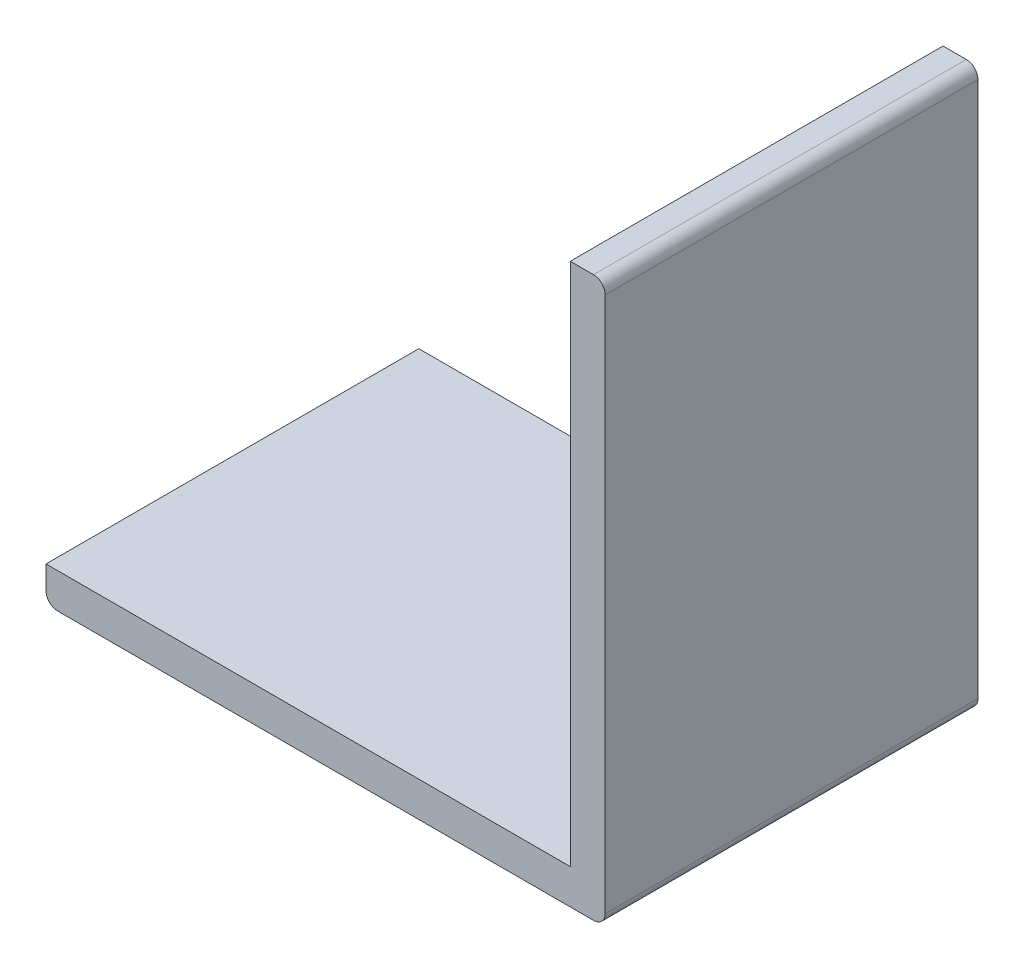
ISO-10303-21;
HEADER;
FILE_DESCRIPTION(('STEP AP214'),'2;1');
FILE_NAME('part.step','',(''),(''),'','','');
FILE_SCHEMA(('AUTOMOTIVE_DESIGN { 1 0 10303 214 1 1 1 1 }'));
ENDSEC;
DATA;
#1=APPLICATION_CONTEXT('core data for automotive mechanical design processes');
#2=APPLICATION_PROTOCOL_DEFINITION('international standard','automotive_design',2000,#1);
#3=PRODUCT_CONTEXT('',#1,'mechanical');
#4=PRODUCT('Part','Part','',(#3));
#5=PRODUCT_RELATED_PRODUCT_CATEGORY('part','',(#4));
#6=PRODUCT_DEFINITION_FORMATION('','',#4);
#7=PRODUCT_DEFINITION_CONTEXT('part definition',#1,'design');
#8=PRODUCT_DEFINITION('design','',#6,#7);
#9=PRODUCT_DEFINITION_SHAPE('','',#8);
#10=(LENGTH_UNIT() NAMED_UNIT(*) SI_UNIT(.MILLI.,.METRE.));
#11=(NAMED_UNIT(*) PLANE_ANGLE_UNIT() SI_UNIT($,.RADIAN.));
#12=(NAMED_UNIT(*) SI_UNIT($,.STERADIAN.) SOLID_ANGLE_UNIT());
#13=UNCERTAINTY_MEASURE_WITH_UNIT(LENGTH_MEASURE(1.E-05),#10,'distance_accuracy_value','');
#14=(GEOMETRIC_REPRESENTATION_CONTEXT(3) GLOBAL_UNCERTAINTY_ASSIGNED_CONTEXT((#13)) GLOBAL_UNIT_ASSIGNED_CONTEXT((#10,
#11,#12)) REPRESENTATION_CONTEXT('',''));
#15=CARTESIAN_POINT('',(0.,0.,0.));
#16=DIRECTION('',(0.,0.,1.));
#17=DIRECTION('',(1.,0.,0.));
#18=AXIS2_PLACEMENT_3D('',#15,#16,#17);
#19=CARTESIAN_POINT('',(-190.441035714286,0.,-101.6));
#20=DIRECTION('',(-1.,0.,0.));
#21=DIRECTION('',(0.,0.,1.));
#22=AXIS2_PLACEMENT_3D('',#19,#20,#21);
#23=PLANE('',#22);
#24=DIRECTION('',(0.,-1.,0.));
#25=VECTOR('',#24,1.);
#26=CARTESIAN_POINT('',(-190.441035714286,0.,0.));
#27=LINE('',#26,#25);
#28=CARTESIAN_POINT('',(-190.441035714286,-5168.81608,0.));
#29=VERTEX_POINT('',#28);
#30=CARTESIAN_POINT('',(-190.441035714286,-5175.16608,0.));
#31=VERTEX_POINT('',#30);
#32=EDGE_CURVE('E145',#29,#31,#27,.T.);
#33=ORIENTED_EDGE('',*,*,#32,.F.);
#34=DIRECTION('',(0.,0.,1.));
#35=VECTOR('',#34,1.);
#36=CARTESIAN_POINT('',(-190.441035714286,-5168.81608,-101.6));
#37=LINE('',#36,#35);
#38=CARTESIAN_POINT('',(-190.441035714286,-5168.81608,-101.6));
#39=VERTEX_POINT('',#38);
#40=EDGE_CURVE('E11',#39,#29,#37,.T.);
#41=ORIENTED_EDGE('',*,*,#40,.F.);
#42=DIRECTION('',(0.,-1.,0.));
#43=VECTOR('',#42,1.);
#44=CARTESIAN_POINT('',(-190.441035714286,0.,-101.6));
#45=LINE('',#44,#43);
#46=CARTESIAN_POINT('',(-190.441035714286,-5175.16608,-101.6));
#47=VERTEX_POINT('',#46);
#48=EDGE_CURVE('E166',#39,#47,#45,.T.);
#49=ORIENTED_EDGE('',*,*,#48,.T.);
#50=DIRECTION('',(0.,0.,1.));
#51=VECTOR('',#50,1.);
#52=CARTESIAN_POINT('',(-190.441035714286,-5175.16608,-101.6));
#53=LINE('',#52,#51);
#54=EDGE_CURVE('E44',#47,#31,#53,.T.);
#55=ORIENTED_EDGE('',*,*,#54,.T.);
#56=EDGE_LOOP('',(#33,#41,#49,#55));
#57=FACE_BOUND('',#56,.T.);
#58=ADVANCED_FACE('F41',(#57),#23,.T.);
#59=CARTESIAN_POINT('',(8.72080541386718E-11,-5168.81608,-101.6));
#60=DIRECTION('',(0.,-1.,0.));
#61=DIRECTION('',(1.,0.,0.));
#62=AXIS2_PLACEMENT_3D('',#59,#60,#61);
#63=PLANE('',#62);
#64=DIRECTION('',(1.,0.,0.));
#65=VECTOR('',#64,1.);
#66=CARTESIAN_POINT('',(8.72080541386718E-11,-5168.81608,0.));
#67=LINE('',#66,#65);
#68=CARTESIAN_POINT('',(-47.5660357142857,-5168.81608,0.));
#69=VERTEX_POINT('',#68);
#70=EDGE_CURVE('E89',#29,#69,#67,.T.);
#71=ORIENTED_EDGE('',*,*,#70,.T.);
#72=DIRECTION('',(0.,0.,1.));
#73=VECTOR('',#72,1.);
#74=CARTESIAN_POINT('',(-47.5660357142857,-5168.81608,-101.6));
#75=LINE('',#74,#73);
#76=CARTESIAN_POINT('',(-47.5660357142857,-5168.81608,-101.6));
#77=VERTEX_POINT('',#76);
#78=EDGE_CURVE('E50',#77,#69,#75,.T.);
#79=ORIENTED_EDGE('',*,*,#78,.F.);
#80=DIRECTION('',(1.,0.,0.));
#81=VECTOR('',#80,1.);
#82=CARTESIAN_POINT('',(8.72080541386718E-11,-5168.81608,-101.6));
#83=LINE('',#82,#81);
#84=EDGE_CURVE('E123',#39,#77,#83,.T.);
#85=ORIENTED_EDGE('',*,*,#84,.F.);
#86=ORIENTED_EDGE('',*,*,#40,.T.);
#87=EDGE_LOOP('',(#71,#79,#85,#86));
#88=FACE_BOUND('',#87,.T.);
#89=ADVANCED_FACE('F214',(#88),#63,.F.);
#90=CARTESIAN_POINT('',(-47.5660357142857,0.,-101.6));
#91=DIRECTION('',(1.,0.,0.));
#92=DIRECTION('',(0.,0.,-1.));
#93=AXIS2_PLACEMENT_3D('',#90,#91,#92);
#94=PLANE('',#93);
#95=DIRECTION('',(0.,1.,0.));
#96=VECTOR('',#95,1.);
#97=CARTESIAN_POINT('',(-47.5660357142857,0.,0.));
#98=LINE('',#97,#96);
#99=CARTESIAN_POINT('',(-47.5660357142857,-5025.94108,0.));
#100=VERTEX_POINT('',#99);
#101=EDGE_CURVE('E130',#69,#100,#98,.T.);
#102=ORIENTED_EDGE('',*,*,#101,.T.);
#103=DIRECTION('',(0.,0.,1.));
#104=VECTOR('',#103,1.);
#105=CARTESIAN_POINT('',(-47.5660357142857,-5025.94108,-101.6));
#106=LINE('',#105,#104);
#107=CARTESIAN_POINT('',(-47.5660357142857,-5025.94108,-101.6));
#108=VERTEX_POINT('',#107);
#109=EDGE_CURVE('E127',#108,#100,#106,.T.);
#110=ORIENTED_EDGE('',*,*,#109,.F.);
#111=DIRECTION('',(0.,1.,0.));
#112=VECTOR('',#111,1.);
#113=CARTESIAN_POINT('',(-47.5660357142857,0.,-101.6));
#114=LINE('',#113,#112);
#115=EDGE_CURVE('E117',#77,#108,#114,.T.);
#116=ORIENTED_EDGE('',*,*,#115,.F.);
#117=ORIENTED_EDGE('',*,*,#78,.T.);
#118=EDGE_LOOP('',(#102,#110,#116,#117));
#119=FACE_BOUND('',#118,.T.);
#120=ADVANCED_FACE('F128',(#119),#94,.F.);
#121=CARTESIAN_POINT('',(0.,-5025.94108,-101.6));
#122=DIRECTION('',(0.,1.,0.));
#123=DIRECTION('',(0.,0.,1.));
#124=AXIS2_PLACEMENT_3D('',#121,#122,#123);
#125=PLANE('',#124);
#126=DIRECTION('',(-1.,0.,0.));
#127=VECTOR('',#126,1.);
#128=CARTESIAN_POINT('',(0.,-5025.94108,0.));
#129=LINE('',#128,#127);
#130=CARTESIAN_POINT('',(-41.2160357142858,-5025.94108,0.));
#131=VERTEX_POINT('',#130);
#132=EDGE_CURVE('E163',#131,#100,#129,.T.);
#133=ORIENTED_EDGE('',*,*,#132,.F.);
#134=DIRECTION('',(0.,0.,1.));
#135=VECTOR('',#134,1.);
#136=CARTESIAN_POINT('',(-41.2160357142858,-5025.94108,-101.6));
#137=LINE('',#136,#135);
#138=CARTESIAN_POINT('',(-41.2160357142858,-5025.94108,-101.6));
#139=VERTEX_POINT('',#138);
#140=EDGE_CURVE('E134',#139,#131,#137,.T.);
#141=ORIENTED_EDGE('',*,*,#140,.F.);
#142=DIRECTION('',(-1.,0.,0.));
#143=VECTOR('',#142,1.);
#144=CARTESIAN_POINT('',(0.,-5025.94108,-101.6));
#145=LINE('',#144,#143);
#146=EDGE_CURVE('E122',#139,#108,#145,.T.);
#147=ORIENTED_EDGE('',*,*,#146,.T.);
#148=ORIENTED_EDGE('',*,*,#109,.T.);
#149=EDGE_LOOP('',(#133,#141,#147,#148));
#150=FACE_BOUND('',#149,.T.);
#151=ADVANCED_FACE('F136',(#150),#125,.T.);
#152=CARTESIAN_POINT('',(-41.2160357142858,-5029.11608,-101.6));
#153=DIRECTION('',(0.,0.,1.));
#154=DIRECTION('',(1.,0.,0.));
#155=AXIS2_PLACEMENT_3D('',#152,#153,#154);
#156=CYLINDRICAL_SURFACE('',#155,3.17499999999985);
#157=CARTESIAN_POINT('',(-41.2160357142858,-5029.11608,0.));
#158=DIRECTION('',(0.,0.,1.));
#159=DIRECTION('',(1.,0.,0.));
#160=AXIS2_PLACEMENT_3D('',#157,#158,#159);
#161=CIRCLE('',#160,3.17499999999985);
#162=CARTESIAN_POINT('',(-38.0410357142858,-5029.11608,0.));
#163=VERTEX_POINT('',#162);
#164=EDGE_CURVE('E160',#131,#163,#161,.F.);
#165=ORIENTED_EDGE('',*,*,#164,.T.);
#166=DIRECTION('',(0.,0.,1.));
#167=VECTOR('',#166,1.);
#168=CARTESIAN_POINT('',(-38.0410357142858,-5029.11608,-101.6));
#169=LINE('',#168,#167);
#170=CARTESIAN_POINT('',(-38.0410357142858,-5029.11608,-101.6));
#171=VERTEX_POINT('',#170);
#172=EDGE_CURVE('E170',#171,#163,#169,.T.);
#173=ORIENTED_EDGE('',*,*,#172,.F.);
#174=CARTESIAN_POINT('',(-41.2160357142858,-5029.11608,-101.6));
#175=DIRECTION('',(0.,0.,1.));
#176=DIRECTION('',(1.,0.,0.));
#177=AXIS2_PLACEMENT_3D('',#174,#175,#176);
#178=CIRCLE('',#177,3.17499999999985);
#179=EDGE_CURVE('E138',#139,#171,#178,.F.);
#180=ORIENTED_EDGE('',*,*,#179,.F.);
#181=ORIENTED_EDGE('',*,*,#140,.T.);
#182=EDGE_LOOP('',(#165,#173,#180,#181));
#183=FACE_BOUND('',#182,.T.);
#184=ADVANCED_FACE('F185',(#183),#156,.T.);
#185=CARTESIAN_POINT('',(-38.0410357142886,0.,-101.6));
#186=DIRECTION('',(1.,0.,0.));
#187=DIRECTION('',(0.,1.,0.));
#188=AXIS2_PLACEMENT_3D('',#185,#186,#187);
#189=PLANE('',#188);
#190=DIRECTION('',(0.,1.,0.));
#191=VECTOR('',#190,1.);
#192=CARTESIAN_POINT('',(-38.0410357142886,0.,0.));
#193=LINE('',#192,#191);
#194=CARTESIAN_POINT('',(-38.0410357142857,-5175.16608,0.));
#195=VERTEX_POINT('',#194);
#196=EDGE_CURVE('E157',#195,#163,#193,.T.);
#197=ORIENTED_EDGE('',*,*,#196,.F.);
#198=DIRECTION('',(0.,0.,1.));
#199=VECTOR('',#198,1.);
#200=CARTESIAN_POINT('',(-38.0410357142857,-5175.16608,-101.6));
#201=LINE('',#200,#199);
#202=CARTESIAN_POINT('',(-38.0410357142857,-5175.16608,-101.6));
#203=VERTEX_POINT('',#202);
#204=EDGE_CURVE('E172',#203,#195,#201,.T.);
#205=ORIENTED_EDGE('',*,*,#204,.F.);
#206=DIRECTION('',(0.,1.,0.));
#207=VECTOR('',#206,1.);
#208=CARTESIAN_POINT('',(-38.0410357142886,0.,-101.6));
#209=LINE('',#208,#207);
#210=EDGE_CURVE('E140',#203,#171,#209,.T.);
#211=ORIENTED_EDGE('',*,*,#210,.T.);
#212=ORIENTED_EDGE('',*,*,#172,.T.);
#213=EDGE_LOOP('',(#197,#205,#211,#212));
#214=FACE_BOUND('',#213,.T.);
#215=ADVANCED_FACE('F203',(#214),#189,.T.);
#216=CARTESIAN_POINT('',(-41.2160357142857,-5175.16608,-101.6));
#217=DIRECTION('',(0.,0.,1.));
#218=DIRECTION('',(1.,0.,0.));
#219=AXIS2_PLACEMENT_3D('',#216,#217,#218);
#220=CYLINDRICAL_SURFACE('',#219,3.17499999999986);
#221=CARTESIAN_POINT('',(-41.2160357142857,-5175.16608,0.));
#222=DIRECTION('',(0.,0.,1.));
#223=DIRECTION('',(1.,0.,0.));
#224=AXIS2_PLACEMENT_3D('',#221,#222,#223);
#225=CIRCLE('',#224,3.17499999999986);
#226=CARTESIAN_POINT('',(-41.2160357142857,-5178.34108,0.));
#227=VERTEX_POINT('',#226);
#228=EDGE_CURVE('E154',#195,#227,#225,.F.);
#229=ORIENTED_EDGE('',*,*,#228,.T.);
#230=DIRECTION('',(0.,0.,1.));
#231=VECTOR('',#230,1.);
#232=CARTESIAN_POINT('',(-41.2160357142857,-5178.34108,-101.6));
#233=LINE('',#232,#231);
#234=CARTESIAN_POINT('',(-41.2160357142857,-5178.34108,-101.6));
#235=VERTEX_POINT('',#234);
#236=EDGE_CURVE('E174',#235,#227,#233,.T.);
#237=ORIENTED_EDGE('',*,*,#236,.F.);
#238=CARTESIAN_POINT('',(-41.2160357142857,-5175.16608,-101.6));
#239=DIRECTION('',(0.,0.,1.));
#240=DIRECTION('',(1.,0.,0.));
#241=AXIS2_PLACEMENT_3D('',#238,#239,#240);
#242=CIRCLE('',#241,3.17499999999986);
#243=EDGE_CURVE('E190',#203,#235,#242,.F.);
#244=ORIENTED_EDGE('',*,*,#243,.F.);
#245=ORIENTED_EDGE('',*,*,#204,.T.);
#246=EDGE_LOOP('',(#229,#237,#244,#245));
#247=FACE_BOUND('',#246,.T.);
#248=ADVANCED_FACE('F204',(#247),#220,.T.);
#249=CARTESIAN_POINT('',(0.,-5178.34108,-101.6));
#250=DIRECTION('',(0.,-1.,0.));
#251=DIRECTION('',(0.,0.,-1.));
#252=AXIS2_PLACEMENT_3D('',#249,#250,#251);
#253=PLANE('',#252);
#254=DIRECTION('',(1.,0.,0.));
#255=VECTOR('',#254,1.);
#256=CARTESIAN_POINT('',(0.,-5178.34108,0.));
#257=LINE('',#256,#255);
#258=CARTESIAN_POINT('',(-187.266035714286,-5178.34108,0.));
#259=VERTEX_POINT('',#258);
#260=EDGE_CURVE('E151',#259,#227,#257,.T.);
#261=ORIENTED_EDGE('',*,*,#260,.F.);
#262=DIRECTION('',(0.,0.,1.));
#263=VECTOR('',#262,1.);
#264=CARTESIAN_POINT('',(-187.266035714286,-5178.34108,-101.6));
#265=LINE('',#264,#263);
#266=CARTESIAN_POINT('',(-187.266035714286,-5178.34108,-101.6));
#267=VERTEX_POINT('',#266);
#268=EDGE_CURVE('E175',#267,#259,#265,.T.);
#269=ORIENTED_EDGE('',*,*,#268,.F.);
#270=DIRECTION('',(1.,0.,0.));
#271=VECTOR('',#270,1.);
#272=CARTESIAN_POINT('',(0.,-5178.34108,-101.6));
#273=LINE('',#272,#271);
#274=EDGE_CURVE('E193',#267,#235,#273,.T.);
#275=ORIENTED_EDGE('',*,*,#274,.T.);
#276=ORIENTED_EDGE('',*,*,#236,.T.);
#277=EDGE_LOOP('',(#261,#269,#275,#276));
#278=FACE_BOUND('',#277,.T.);
#279=ADVANCED_FACE('F201',(#278),#253,.T.);
#280=CARTESIAN_POINT('',(-187.266035714286,-5175.16608,-101.6));
#281=DIRECTION('',(0.,0.,1.));
#282=DIRECTION('',(1.,0.,0.));
#283=AXIS2_PLACEMENT_3D('',#280,#281,#282);
#284=CYLINDRICAL_SURFACE('',#283,3.17499999999986);
#285=CARTESIAN_POINT('',(-187.266035714286,-5175.16608,0.));
#286=DIRECTION('',(0.,0.,1.));
#287=DIRECTION('',(1.,0.,0.));
#288=AXIS2_PLACEMENT_3D('',#285,#286,#287);
#289=CIRCLE('',#288,3.17499999999986);
#290=EDGE_CURVE('E148',#31,#259,#289,.T.);
#291=ORIENTED_EDGE('',*,*,#290,.F.);
#292=ORIENTED_EDGE('',*,*,#54,.F.);
#293=CARTESIAN_POINT('',(-187.266035714286,-5175.16608,-101.6));
#294=DIRECTION('',(0.,0.,1.));
#295=DIRECTION('',(1.,0.,0.));
#296=AXIS2_PLACEMENT_3D('',#293,#294,#295);
#297=CIRCLE('',#296,3.17499999999986);
#298=EDGE_CURVE('E198',#47,#267,#297,.T.);
#299=ORIENTED_EDGE('',*,*,#298,.T.);
#300=ORIENTED_EDGE('',*,*,#268,.T.);
#301=EDGE_LOOP('',(#291,#292,#299,#300));
#302=FACE_BOUND('',#301,.T.);
#303=ADVANCED_FACE('F177',(#302),#284,.T.);
#304=CARTESIAN_POINT('',(0.,0.,-101.6));
#305=DIRECTION('',(0.,0.,1.));
#306=DIRECTION('',(1.,0.,0.));
#307=AXIS2_PLACEMENT_3D('',#304,#305,#306);
#308=PLANE('',#307);
#309=ORIENTED_EDGE('',*,*,#48,.F.);
#310=ORIENTED_EDGE('',*,*,#84,.T.);
#311=ORIENTED_EDGE('',*,*,#115,.T.);
#312=ORIENTED_EDGE('',*,*,#146,.F.);
#313=ORIENTED_EDGE('',*,*,#179,.T.);
#314=ORIENTED_EDGE('',*,*,#210,.F.);
#315=ORIENTED_EDGE('',*,*,#243,.T.);
#316=ORIENTED_EDGE('',*,*,#274,.F.);
#317=ORIENTED_EDGE('',*,*,#298,.F.);
#318=EDGE_LOOP('',(#309,#310,#311,#312,#313,#314,#315,#316,#317));
#319=FACE_BOUND('',#318,.T.);
#320=ADVANCED_FACE('F120',(#319),#308,.F.);
#321=CARTESIAN_POINT('',(0.,0.,0.));
#322=DIRECTION('',(0.,0.,1.));
#323=DIRECTION('',(1.,0.,0.));
#324=AXIS2_PLACEMENT_3D('',#321,#322,#323);
#325=PLANE('',#324);
#326=ORIENTED_EDGE('',*,*,#32,.T.);
#327=ORIENTED_EDGE('',*,*,#290,.T.);
#328=ORIENTED_EDGE('',*,*,#260,.T.);
#329=ORIENTED_EDGE('',*,*,#228,.F.);
#330=ORIENTED_EDGE('',*,*,#196,.T.);
#331=ORIENTED_EDGE('',*,*,#164,.F.);
#332=ORIENTED_EDGE('',*,*,#132,.T.);
#333=ORIENTED_EDGE('',*,*,#101,.F.);
#334=ORIENTED_EDGE('',*,*,#70,.F.);
#335=EDGE_LOOP('',(#326,#327,#328,#329,#330,#331,#332,#333,#334));
#336=FACE_BOUND('',#335,.T.);
#337=ADVANCED_FACE('F179',(#336),#325,.T.);
#338=CLOSED_SHELL('',(#58,#89,#120,#151,#184,#215,#248,#279,#303,#320,#337));
#339=MANIFOLD_SOLID_BREP('B2',#338);
#340=ADVANCED_BREP_SHAPE_REPRESENTATION('',(#18,#339),#14);
#341=SHAPE_DEFINITION_REPRESENTATION(#9,#340);
ENDSEC;
END-ISO-10303-21;
